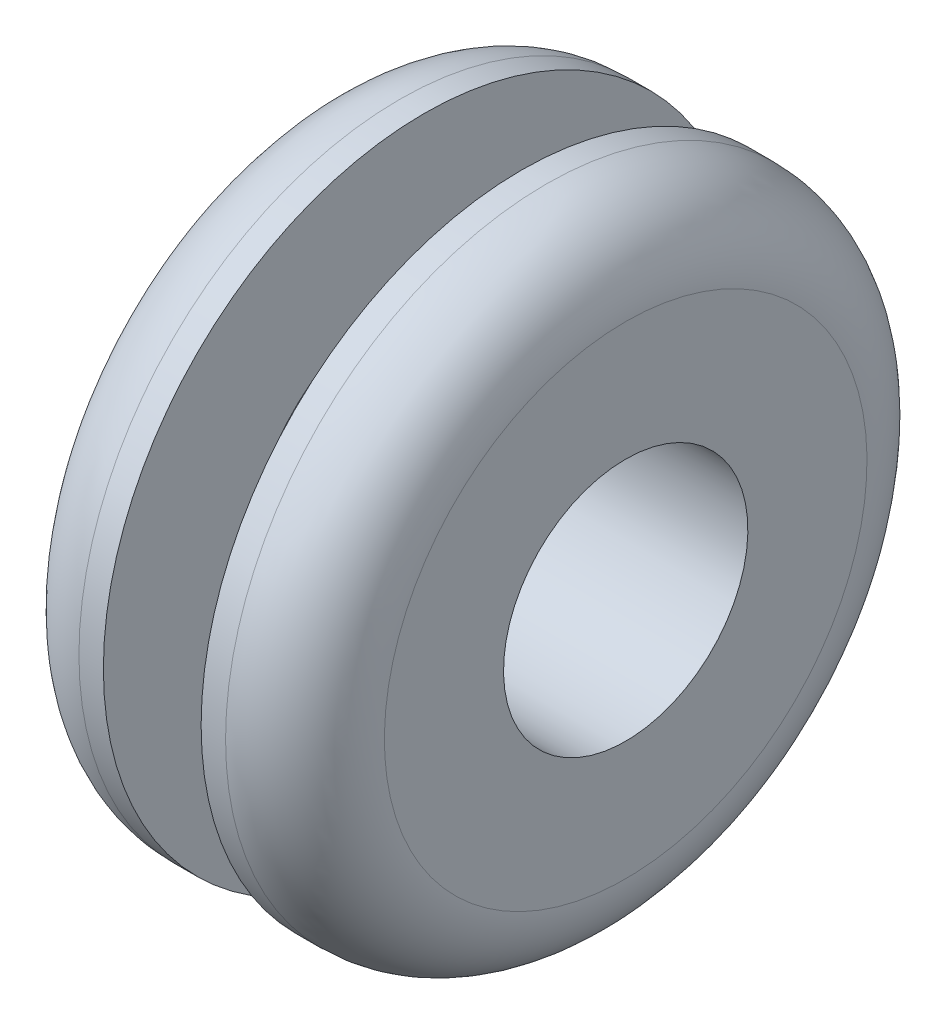
ISO-10303-21;
HEADER;
FILE_DESCRIPTION(('STEP AP214'),'2;1');
FILE_NAME('part.step','',(''),(''),'','','');
FILE_SCHEMA(('AUTOMOTIVE_DESIGN { 1 0 10303 214 1 1 1 1 }'));
ENDSEC;
DATA;
#1=APPLICATION_CONTEXT('core data for automotive mechanical design processes');
#2=APPLICATION_PROTOCOL_DEFINITION('international standard','automotive_design',2000,#1);
#3=PRODUCT_CONTEXT('',#1,'mechanical');
#4=PRODUCT('Part','Part','',(#3));
#5=PRODUCT_RELATED_PRODUCT_CATEGORY('part','',(#4));
#6=PRODUCT_DEFINITION_FORMATION('','',#4);
#7=PRODUCT_DEFINITION_CONTEXT('part definition',#1,'design');
#8=PRODUCT_DEFINITION('design','',#6,#7);
#9=PRODUCT_DEFINITION_SHAPE('','',#8);
#10=(LENGTH_UNIT() NAMED_UNIT(*) SI_UNIT(.MILLI.,.METRE.));
#11=(NAMED_UNIT(*) PLANE_ANGLE_UNIT() SI_UNIT($,.RADIAN.));
#12=(NAMED_UNIT(*) SI_UNIT($,.STERADIAN.) SOLID_ANGLE_UNIT());
#13=UNCERTAINTY_MEASURE_WITH_UNIT(LENGTH_MEASURE(1.E-05),#10,'distance_accuracy_value','');
#14=(GEOMETRIC_REPRESENTATION_CONTEXT(3) GLOBAL_UNCERTAINTY_ASSIGNED_CONTEXT((#13)) GLOBAL_UNIT_ASSIGNED_CONTEXT((#10,
#11,#12)) REPRESENTATION_CONTEXT('',''));
#15=CARTESIAN_POINT('',(0.,0.,0.));
#16=DIRECTION('',(0.,0.,1.));
#17=DIRECTION('',(1.,0.,0.));
#18=AXIS2_PLACEMENT_3D('',#15,#16,#17);
#19=CARTESIAN_POINT('',(-0.8,1.,0.));
#20=DIRECTION('',(1.,0.,0.));
#21=DIRECTION('',(0.,1.,0.));
#22=AXIS2_PLACEMENT_3D('',#19,#20,#21);
#23=PLANE('',#22);
#24=CARTESIAN_POINT('',(-0.799999999999999,-2.,0.));
#25=DIRECTION('',(1.,0.,0.));
#26=DIRECTION('',(0.,1.,0.));
#27=AXIS2_PLACEMENT_3D('',#24,#25,#26);
#28=CIRCLE('',#27,5.25);
#29=CARTESIAN_POINT('',(-0.8,3.25,0.));
#30=VERTEX_POINT('',#29);
#31=EDGE_CURVE('E52',#30,#30,#28,.T.);
#32=ORIENTED_EDGE('',*,*,#31,.T.);
#33=EDGE_LOOP('',(#32));
#34=FACE_BOUND('',#33,.T.);
#35=CARTESIAN_POINT('',(-0.8,-2.,0.));
#36=DIRECTION('',(1.,0.,0.));
#37=DIRECTION('',(0.,1.,0.));
#38=AXIS2_PLACEMENT_3D('',#35,#36,#37);
#39=CIRCLE('',#38,3.);
#40=CARTESIAN_POINT('',(-0.8,1.,0.));
#41=VERTEX_POINT('',#40);
#42=EDGE_CURVE('E67',#41,#41,#39,.T.);
#43=ORIENTED_EDGE('',*,*,#42,.F.);
#44=EDGE_LOOP('',(#43));
#45=FACE_BOUND('',#44,.T.);
#46=ADVANCED_FACE('F32',(#34,#45),#23,.T.);
#47=CARTESIAN_POINT('',(0.,-2.,0.));
#48=DIRECTION('',(1.,0.,0.));
#49=DIRECTION('',(0.,1.,0.));
#50=AXIS2_PLACEMENT_3D('',#47,#48,#49);
#51=CYLINDRICAL_SURFACE('',#50,5.25);
#52=CARTESIAN_POINT('',(-1.2,-2.,0.));
#53=DIRECTION('',(-1.,0.,0.));
#54=DIRECTION('',(0.,-1.,0.));
#55=AXIS2_PLACEMENT_3D('',#52,#53,#54);
#56=CIRCLE('',#55,5.25);
#57=CARTESIAN_POINT('',(-1.2,-7.25,0.));
#58=VERTEX_POINT('',#57);
#59=EDGE_CURVE('E47',#58,#58,#56,.F.);
#60=ORIENTED_EDGE('',*,*,#59,.T.);
#61=EDGE_LOOP('',(#60));
#62=FACE_BOUND('',#61,.T.);
#63=ORIENTED_EDGE('',*,*,#31,.F.);
#64=EDGE_LOOP('',(#63));
#65=FACE_BOUND('',#64,.T.);
#66=ADVANCED_FACE('F75',(#62,#65),#51,.T.);
#67=CARTESIAN_POINT('',(-2.5,3.25,0.));
#68=DIRECTION('',(-1.,0.,0.));
#69=DIRECTION('',(0.,-1.,0.));
#70=AXIS2_PLACEMENT_3D('',#67,#68,#69);
#71=PLANE('',#70);
#72=CARTESIAN_POINT('',(-2.5,-2.,0.));
#73=DIRECTION('',(-1.,0.,0.));
#74=DIRECTION('',(0.,-1.,0.));
#75=AXIS2_PLACEMENT_3D('',#72,#73,#74);
#76=CIRCLE('',#75,3.95);
#77=CARTESIAN_POINT('',(-2.5,-5.95,0.));
#78=VERTEX_POINT('',#77);
#79=EDGE_CURVE('E43',#78,#78,#76,.T.);
#80=ORIENTED_EDGE('',*,*,#79,.T.);
#81=EDGE_LOOP('',(#80));
#82=FACE_BOUND('',#81,.T.);
#83=CARTESIAN_POINT('',(-2.5,-2.,0.));
#84=DIRECTION('',(1.,0.,0.));
#85=DIRECTION('',(0.,1.,0.));
#86=AXIS2_PLACEMENT_3D('',#83,#84,#85);
#87=CIRCLE('',#86,2.);
#88=CARTESIAN_POINT('',(-2.5,0.,0.));
#89=VERTEX_POINT('',#88);
#90=EDGE_CURVE('E55',#89,#89,#87,.T.);
#91=ORIENTED_EDGE('',*,*,#90,.T.);
#92=EDGE_LOOP('',(#91));
#93=FACE_BOUND('',#92,.T.);
#94=ADVANCED_FACE('F81',(#82,#93),#71,.T.);
#95=CARTESIAN_POINT('',(0.,-2.,0.));
#96=DIRECTION('',(1.,0.,0.));
#97=DIRECTION('',(0.,1.,0.));
#98=AXIS2_PLACEMENT_3D('',#95,#96,#97);
#99=CYLINDRICAL_SURFACE('',#98,2.);
#100=CARTESIAN_POINT('',(2.5,-2.,0.));
#101=DIRECTION('',(1.,0.,0.));
#102=DIRECTION('',(0.,1.,0.));
#103=AXIS2_PLACEMENT_3D('',#100,#101,#102);
#104=CIRCLE('',#103,2.);
#105=CARTESIAN_POINT('',(2.5,0.,0.));
#106=VERTEX_POINT('',#105);
#107=EDGE_CURVE('E58',#106,#106,#104,.T.);
#108=ORIENTED_EDGE('',*,*,#107,.T.);
#109=EDGE_LOOP('',(#108));
#110=FACE_BOUND('',#109,.T.);
#111=ORIENTED_EDGE('',*,*,#90,.F.);
#112=EDGE_LOOP('',(#111));
#113=FACE_BOUND('',#112,.T.);
#114=ADVANCED_FACE('F103',(#110,#113),#99,.F.);
#115=CARTESIAN_POINT('',(2.5,3.25,0.));
#116=DIRECTION('',(1.,0.,0.));
#117=DIRECTION('',(0.,1.,0.));
#118=AXIS2_PLACEMENT_3D('',#115,#116,#117);
#119=PLANE('',#118);
#120=CARTESIAN_POINT('',(2.5,-2.,0.));
#121=DIRECTION('',(1.,0.,0.));
#122=DIRECTION('',(0.,1.,0.));
#123=AXIS2_PLACEMENT_3D('',#120,#121,#122);
#124=CIRCLE('',#123,3.95);
#125=CARTESIAN_POINT('',(2.5,1.95,0.));
#126=VERTEX_POINT('',#125);
#127=EDGE_CURVE('E39',#126,#126,#124,.T.);
#128=ORIENTED_EDGE('',*,*,#127,.T.);
#129=EDGE_LOOP('',(#128));
#130=FACE_BOUND('',#129,.T.);
#131=ORIENTED_EDGE('',*,*,#107,.F.);
#132=EDGE_LOOP('',(#131));
#133=FACE_BOUND('',#132,.T.);
#134=ADVANCED_FACE('F107',(#130,#133),#119,.T.);
#135=CARTESIAN_POINT('',(0.,-2.,0.));
#136=DIRECTION('',(1.,0.,0.));
#137=DIRECTION('',(0.,1.,0.));
#138=AXIS2_PLACEMENT_3D('',#135,#136,#137);
#139=CYLINDRICAL_SURFACE('',#138,5.25);
#140=CARTESIAN_POINT('',(1.2,-2.,0.));
#141=DIRECTION('',(1.,0.,0.));
#142=DIRECTION('',(0.,1.,0.));
#143=AXIS2_PLACEMENT_3D('',#140,#141,#142);
#144=CIRCLE('',#143,5.25);
#145=CARTESIAN_POINT('',(1.2,3.25,0.));
#146=VERTEX_POINT('',#145);
#147=EDGE_CURVE('E10',#146,#146,#144,.F.);
#148=ORIENTED_EDGE('',*,*,#147,.T.);
#149=EDGE_LOOP('',(#148));
#150=FACE_BOUND('',#149,.T.);
#151=CARTESIAN_POINT('',(0.800000000000001,-2.,0.));
#152=DIRECTION('',(1.,0.,0.));
#153=DIRECTION('',(0.,1.,0.));
#154=AXIS2_PLACEMENT_3D('',#151,#152,#153);
#155=CIRCLE('',#154,5.25);
#156=CARTESIAN_POINT('',(0.8,3.25,0.));
#157=VERTEX_POINT('',#156);
#158=EDGE_CURVE('E61',#157,#157,#155,.T.);
#159=ORIENTED_EDGE('',*,*,#158,.T.);
#160=EDGE_LOOP('',(#159));
#161=FACE_BOUND('',#160,.T.);
#162=ADVANCED_FACE('F113',(#150,#161),#139,.T.);
#163=CARTESIAN_POINT('',(0.8,1.,0.));
#164=DIRECTION('',(-1.,0.,0.));
#165=DIRECTION('',(0.,-1.,0.));
#166=AXIS2_PLACEMENT_3D('',#163,#164,#165);
#167=PLANE('',#166);
#168=CARTESIAN_POINT('',(0.8,-2.,0.));
#169=DIRECTION('',(1.,0.,0.));
#170=DIRECTION('',(0.,1.,0.));
#171=AXIS2_PLACEMENT_3D('',#168,#169,#170);
#172=CIRCLE('',#171,3.);
#173=CARTESIAN_POINT('',(0.8,1.,0.));
#174=VERTEX_POINT('',#173);
#175=EDGE_CURVE('E64',#174,#174,#172,.T.);
#176=ORIENTED_EDGE('',*,*,#175,.T.);
#177=EDGE_LOOP('',(#176));
#178=FACE_BOUND('',#177,.T.);
#179=ORIENTED_EDGE('',*,*,#158,.F.);
#180=EDGE_LOOP('',(#179));
#181=FACE_BOUND('',#180,.T.);
#182=ADVANCED_FACE('F93',(#178,#181),#167,.T.);
#183=CARTESIAN_POINT('',(0.,-2.,0.));
#184=DIRECTION('',(1.,0.,0.));
#185=DIRECTION('',(0.,1.,0.));
#186=AXIS2_PLACEMENT_3D('',#183,#184,#185);
#187=CYLINDRICAL_SURFACE('',#186,3.);
#188=ORIENTED_EDGE('',*,*,#42,.T.);
#189=EDGE_LOOP('',(#188));
#190=FACE_BOUND('',#189,.T.);
#191=ORIENTED_EDGE('',*,*,#175,.F.);
#192=EDGE_LOOP('',(#191));
#193=FACE_BOUND('',#192,.T.);
#194=ADVANCED_FACE('F71',(#190,#193),#187,.T.);
#195=CARTESIAN_POINT('',(-1.2,-2.,0.));
#196=DIRECTION('',(-1.,0.,0.));
#197=DIRECTION('',(0.,-1.,0.));
#198=AXIS2_PLACEMENT_3D('',#195,#196,#197);
#199=TOROIDAL_SURFACE('',#198,3.95,1.3);
#200=ORIENTED_EDGE('',*,*,#79,.F.);
#201=EDGE_LOOP('',(#200));
#202=FACE_BOUND('',#201,.T.);
#203=ORIENTED_EDGE('',*,*,#59,.F.);
#204=EDGE_LOOP('',(#203));
#205=FACE_BOUND('',#204,.T.);
#206=ADVANCED_FACE('F85',(#202,#205),#199,.T.);
#207=CARTESIAN_POINT('',(1.2,-2.,0.));
#208=DIRECTION('',(1.,0.,0.));
#209=DIRECTION('',(0.,1.,0.));
#210=AXIS2_PLACEMENT_3D('',#207,#208,#209);
#211=TOROIDAL_SURFACE('',#210,3.95,1.3);
#212=ORIENTED_EDGE('',*,*,#147,.F.);
#213=EDGE_LOOP('',(#212));
#214=FACE_BOUND('',#213,.T.);
#215=ORIENTED_EDGE('',*,*,#127,.F.);
#216=EDGE_LOOP('',(#215));
#217=FACE_BOUND('',#216,.T.);
#218=ADVANCED_FACE('F34',(#214,#217),#211,.T.);
#219=CLOSED_SHELL('',(#46,#66,#94,#114,#134,#162,#182,#194,#206,#218));
#220=MANIFOLD_SOLID_BREP('B2',#219);
#221=ADVANCED_BREP_SHAPE_REPRESENTATION('',(#18,#220),#14);
#222=SHAPE_DEFINITION_REPRESENTATION(#9,#221);
ENDSEC;
END-ISO-10303-21;
